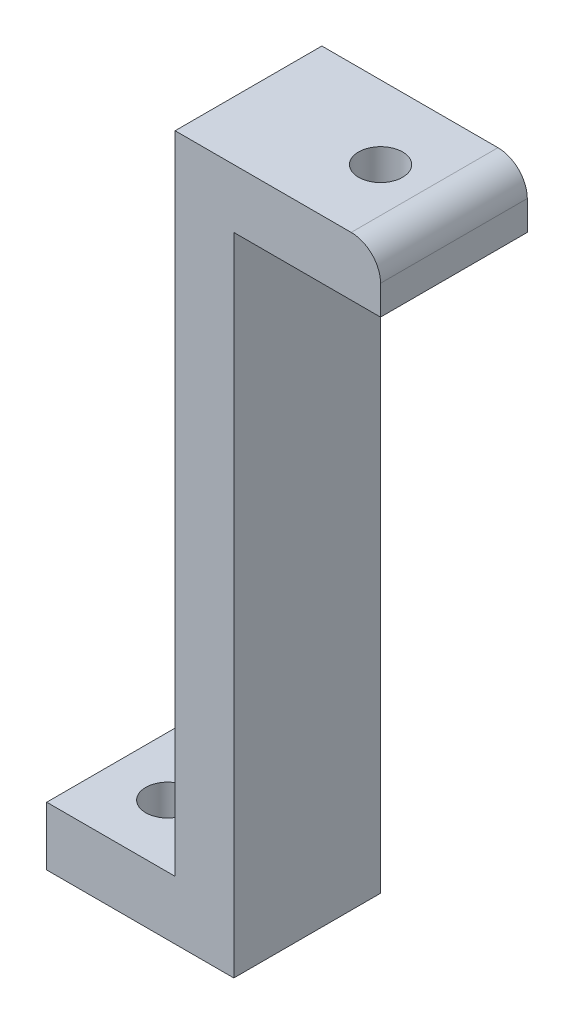
ISO-10303-21;
HEADER;
FILE_DESCRIPTION(('STEP AP214'),'2;1');
FILE_NAME('part.step','',(''),(''),'','','');
FILE_SCHEMA(('AUTOMOTIVE_DESIGN { 1 0 10303 214 1 1 1 1 }'));
ENDSEC;
DATA;
#1=APPLICATION_CONTEXT('core data for automotive mechanical design processes');
#2=APPLICATION_PROTOCOL_DEFINITION('international standard','automotive_design',2000,#1);
#3=PRODUCT_CONTEXT('',#1,'mechanical');
#4=PRODUCT('Part','Part','',(#3));
#5=PRODUCT_RELATED_PRODUCT_CATEGORY('part','',(#4));
#6=PRODUCT_DEFINITION_FORMATION('','',#4);
#7=PRODUCT_DEFINITION_CONTEXT('part definition',#1,'design');
#8=PRODUCT_DEFINITION('design','',#6,#7);
#9=PRODUCT_DEFINITION_SHAPE('','',#8);
#10=(LENGTH_UNIT() NAMED_UNIT(*) SI_UNIT(.MILLI.,.METRE.));
#11=(NAMED_UNIT(*) PLANE_ANGLE_UNIT() SI_UNIT($,.RADIAN.));
#12=(NAMED_UNIT(*) SI_UNIT($,.STERADIAN.) SOLID_ANGLE_UNIT());
#13=UNCERTAINTY_MEASURE_WITH_UNIT(LENGTH_MEASURE(1.E-05),#10,'distance_accuracy_value','');
#14=(GEOMETRIC_REPRESENTATION_CONTEXT(3) GLOBAL_UNCERTAINTY_ASSIGNED_CONTEXT((#13)) GLOBAL_UNIT_ASSIGNED_CONTEXT((#10,
#11,#12)) REPRESENTATION_CONTEXT('',''));
#15=CARTESIAN_POINT('',(0.,0.,0.));
#16=DIRECTION('',(0.,0.,1.));
#17=DIRECTION('',(1.,0.,0.));
#18=AXIS2_PLACEMENT_3D('',#15,#16,#17);
#19=CARTESIAN_POINT('',(0.,-4.,10.));
#20=DIRECTION('',(-1.,0.,0.));
#21=DIRECTION('',(0.,0.,1.));
#22=AXIS2_PLACEMENT_3D('',#19,#20,#21);
#23=PLANE('',#22);
#24=DIRECTION('',(0.,1.,0.));
#25=VECTOR('',#24,1.);
#26=CARTESIAN_POINT('',(0.,-4.,0.));
#27=LINE('',#26,#25);
#28=CARTESIAN_POINT('',(0.,-4.,0.));
#29=VERTEX_POINT('',#28);
#30=CARTESIAN_POINT('',(0.,-2.,0.));
#31=VERTEX_POINT('',#30);
#32=EDGE_CURVE('E156',#29,#31,#27,.T.);
#33=ORIENTED_EDGE('',*,*,#32,.T.);
#34=DIRECTION('',(0.,0.,-1.));
#35=VECTOR('',#34,1.);
#36=CARTESIAN_POINT('',(0.,-2.,10.));
#37=LINE('',#36,#35);
#38=CARTESIAN_POINT('',(0.,-2.,10.));
#39=VERTEX_POINT('',#38);
#40=EDGE_CURVE('E48',#31,#39,#37,.F.);
#41=ORIENTED_EDGE('',*,*,#40,.T.);
#42=DIRECTION('',(0.,1.,0.));
#43=VECTOR('',#42,1.);
#44=CARTESIAN_POINT('',(0.,-4.,10.));
#45=LINE('',#44,#43);
#46=CARTESIAN_POINT('',(0.,-4.,10.));
#47=VERTEX_POINT('',#46);
#48=EDGE_CURVE('E121',#47,#39,#45,.T.);
#49=ORIENTED_EDGE('',*,*,#48,.F.);
#50=DIRECTION('',(0.,0.,-1.));
#51=VECTOR('',#50,1.);
#52=CARTESIAN_POINT('',(0.,-4.,10.));
#53=LINE('',#52,#51);
#54=EDGE_CURVE('E155',#47,#29,#53,.T.);
#55=ORIENTED_EDGE('',*,*,#54,.T.);
#56=EDGE_LOOP('',(#33,#41,#49,#55));
#57=FACE_BOUND('',#56,.T.);
#58=ADVANCED_FACE('F39',(#57),#23,.F.);
#59=CARTESIAN_POINT('',(0.,0.,10.));
#60=DIRECTION('',(0.,-1.,0.));
#61=DIRECTION('',(1.,0.,0.));
#62=AXIS2_PLACEMENT_3D('',#59,#60,#61);
#63=PLANE('',#62);
#64=CARTESIAN_POINT('',(-5.,0.,5.));
#65=DIRECTION('',(0.,-1.,0.));
#66=DIRECTION('',(1.,0.,0.));
#67=AXIS2_PLACEMENT_3D('',#64,#65,#66);
#68=CIRCLE('',#67,1.5);
#69=CARTESIAN_POINT('',(-3.5,0.,5.));
#70=VERTEX_POINT('',#69);
#71=EDGE_CURVE('E240',#70,#70,#68,.T.);
#72=ORIENTED_EDGE('',*,*,#71,.T.);
#73=EDGE_LOOP('',(#72));
#74=FACE_BOUND('',#73,.T.);
#75=DIRECTION('',(-1.,0.,0.));
#76=VECTOR('',#75,1.);
#77=CARTESIAN_POINT('',(0.,0.,10.));
#78=LINE('',#77,#76);
#79=CARTESIAN_POINT('',(-2.,0.,10.));
#80=VERTEX_POINT('',#79);
#81=CARTESIAN_POINT('',(-14.,0.,10.));
#82=VERTEX_POINT('',#81);
#83=EDGE_CURVE('E110',#80,#82,#78,.T.);
#84=ORIENTED_EDGE('',*,*,#83,.F.);
#85=DIRECTION('',(0.,0.,-1.));
#86=VECTOR('',#85,1.);
#87=CARTESIAN_POINT('',(-2.,0.,10.));
#88=LINE('',#87,#86);
#89=CARTESIAN_POINT('',(-2.,0.,0.));
#90=VERTEX_POINT('',#89);
#91=EDGE_CURVE('E130',#80,#90,#88,.T.);
#92=ORIENTED_EDGE('',*,*,#91,.T.);
#93=DIRECTION('',(-1.,0.,0.));
#94=VECTOR('',#93,1.);
#95=CARTESIAN_POINT('',(0.,0.,0.));
#96=LINE('',#95,#94);
#97=CARTESIAN_POINT('',(-14.,0.,0.));
#98=VERTEX_POINT('',#97);
#99=EDGE_CURVE('E126',#90,#98,#96,.T.);
#100=ORIENTED_EDGE('',*,*,#99,.T.);
#101=DIRECTION('',(0.,0.,-1.));
#102=VECTOR('',#101,1.);
#103=CARTESIAN_POINT('',(-14.,0.,10.));
#104=LINE('',#103,#102);
#105=EDGE_CURVE('E124',#82,#98,#104,.T.);
#106=ORIENTED_EDGE('',*,*,#105,.F.);
#107=EDGE_LOOP('',(#84,#92,#100,#106));
#108=FACE_BOUND('',#107,.T.);
#109=ADVANCED_FACE('F125',(#74,#108),#63,.F.);
#110=CARTESIAN_POINT('',(-14.,0.,10.));
#111=DIRECTION('',(1.,0.,0.));
#112=DIRECTION('',(0.,1.,0.));
#113=AXIS2_PLACEMENT_3D('',#110,#111,#112);
#114=PLANE('',#113);
#115=DIRECTION('',(0.,-1.,0.));
#116=VECTOR('',#115,1.);
#117=CARTESIAN_POINT('',(-14.,0.,0.));
#118=LINE('',#117,#116);
#119=CARTESIAN_POINT('',(-14.,-44.,0.));
#120=VERTEX_POINT('',#119);
#121=EDGE_CURVE('E162',#98,#120,#118,.T.);
#122=ORIENTED_EDGE('',*,*,#121,.T.);
#123=DIRECTION('',(0.,0.,-1.));
#124=VECTOR('',#123,1.);
#125=CARTESIAN_POINT('',(-14.,-44.,10.));
#126=LINE('',#125,#124);
#127=CARTESIAN_POINT('',(-14.,-44.,10.));
#128=VERTEX_POINT('',#127);
#129=EDGE_CURVE('E131',#128,#120,#126,.T.);
#130=ORIENTED_EDGE('',*,*,#129,.F.);
#131=DIRECTION('',(0.,-1.,0.));
#132=VECTOR('',#131,1.);
#133=CARTESIAN_POINT('',(-14.,0.,10.));
#134=LINE('',#133,#132);
#135=EDGE_CURVE('E114',#82,#128,#134,.T.);
#136=ORIENTED_EDGE('',*,*,#135,.F.);
#137=ORIENTED_EDGE('',*,*,#105,.T.);
#138=EDGE_LOOP('',(#122,#130,#136,#137));
#139=FACE_BOUND('',#138,.T.);
#140=ADVANCED_FACE('F133',(#139),#114,.F.);
#141=CARTESIAN_POINT('',(-14.,-44.,10.));
#142=DIRECTION('',(0.,-1.,0.));
#143=DIRECTION('',(0.,0.,-1.));
#144=AXIS2_PLACEMENT_3D('',#141,#142,#143);
#145=PLANE('',#144);
#146=CARTESIAN_POINT('',(-18.75,-44.,5.75));
#147=DIRECTION('',(0.,1.,0.));
#148=DIRECTION('',(0.,0.,1.));
#149=AXIS2_PLACEMENT_3D('',#146,#147,#148);
#150=CIRCLE('',#149,1.5);
#151=CARTESIAN_POINT('',(-18.75,-44.,7.25));
#152=VERTEX_POINT('',#151);
#153=EDGE_CURVE('E204',#152,#152,#150,.T.);
#154=ORIENTED_EDGE('',*,*,#153,.F.);
#155=EDGE_LOOP('',(#154));
#156=FACE_BOUND('',#155,.T.);
#157=DIRECTION('',(-1.,0.,0.));
#158=VECTOR('',#157,1.);
#159=CARTESIAN_POINT('',(-14.,-44.,0.));
#160=LINE('',#159,#158);
#161=CARTESIAN_POINT('',(-22.75,-44.,0.));
#162=VERTEX_POINT('',#161);
#163=EDGE_CURVE('E165',#120,#162,#160,.T.);
#164=ORIENTED_EDGE('',*,*,#163,.T.);
#165=DIRECTION('',(0.,0.,-1.));
#166=VECTOR('',#165,1.);
#167=CARTESIAN_POINT('',(-22.75,-44.,10.));
#168=LINE('',#167,#166);
#169=CARTESIAN_POINT('',(-22.75,-44.,10.));
#170=VERTEX_POINT('',#169);
#171=EDGE_CURVE('E195',#170,#162,#168,.T.);
#172=ORIENTED_EDGE('',*,*,#171,.F.);
#173=DIRECTION('',(-1.,0.,0.));
#174=VECTOR('',#173,1.);
#175=CARTESIAN_POINT('',(-14.,-44.,10.));
#176=LINE('',#175,#174);
#177=EDGE_CURVE('E137',#128,#170,#176,.T.);
#178=ORIENTED_EDGE('',*,*,#177,.F.);
#179=ORIENTED_EDGE('',*,*,#129,.T.);
#180=EDGE_LOOP('',(#164,#172,#178,#179));
#181=FACE_BOUND('',#180,.T.);
#182=ADVANCED_FACE('F214',(#156,#181),#145,.F.);
#183=CARTESIAN_POINT('',(-22.75,-44.,10.));
#184=DIRECTION('',(1.,0.,0.));
#185=DIRECTION('',(0.,0.,-1.));
#186=AXIS2_PLACEMENT_3D('',#183,#184,#185);
#187=PLANE('',#186);
#188=DIRECTION('',(0.,-1.,0.));
#189=VECTOR('',#188,1.);
#190=CARTESIAN_POINT('',(-22.75,-44.,0.));
#191=LINE('',#190,#189);
#192=CARTESIAN_POINT('',(-22.75,-48.,0.));
#193=VERTEX_POINT('',#192);
#194=EDGE_CURVE('E168',#162,#193,#191,.T.);
#195=ORIENTED_EDGE('',*,*,#194,.T.);
#196=DIRECTION('',(0.,0.,-1.));
#197=VECTOR('',#196,1.);
#198=CARTESIAN_POINT('',(-22.75,-48.,10.));
#199=LINE('',#198,#197);
#200=CARTESIAN_POINT('',(-22.75,-48.,10.));
#201=VERTEX_POINT('',#200);
#202=EDGE_CURVE('E191',#201,#193,#199,.T.);
#203=ORIENTED_EDGE('',*,*,#202,.F.);
#204=DIRECTION('',(0.,-1.,0.));
#205=VECTOR('',#204,1.);
#206=CARTESIAN_POINT('',(-22.75,-44.,10.));
#207=LINE('',#206,#205);
#208=EDGE_CURVE('E140',#170,#201,#207,.T.);
#209=ORIENTED_EDGE('',*,*,#208,.F.);
#210=ORIENTED_EDGE('',*,*,#171,.T.);
#211=EDGE_LOOP('',(#195,#203,#209,#210));
#212=FACE_BOUND('',#211,.T.);
#213=ADVANCED_FACE('F221',(#212),#187,.F.);
#214=CARTESIAN_POINT('',(-22.75,-48.,10.));
#215=DIRECTION('',(0.,1.,0.));
#216=DIRECTION('',(0.,0.,1.));
#217=AXIS2_PLACEMENT_3D('',#214,#215,#216);
#218=PLANE('',#217);
#219=CARTESIAN_POINT('',(-18.75,-48.,5.75));
#220=DIRECTION('',(0.,1.,0.));
#221=DIRECTION('',(0.,0.,1.));
#222=AXIS2_PLACEMENT_3D('',#219,#220,#221);
#223=CIRCLE('',#222,1.5);
#224=CARTESIAN_POINT('',(-18.75,-48.,7.25));
#225=VERTEX_POINT('',#224);
#226=EDGE_CURVE('E159',#225,#225,#223,.T.);
#227=ORIENTED_EDGE('',*,*,#226,.T.);
#228=EDGE_LOOP('',(#227));
#229=FACE_BOUND('',#228,.T.);
#230=DIRECTION('',(1.,0.,0.));
#231=VECTOR('',#230,1.);
#232=CARTESIAN_POINT('',(-22.75,-48.,0.));
#233=LINE('',#232,#231);
#234=CARTESIAN_POINT('',(-10.,-48.,0.));
#235=VERTEX_POINT('',#234);
#236=EDGE_CURVE('E171',#193,#235,#233,.T.);
#237=ORIENTED_EDGE('',*,*,#236,.T.);
#238=DIRECTION('',(0.,0.,-1.));
#239=VECTOR('',#238,1.);
#240=CARTESIAN_POINT('',(-10.,-48.,10.));
#241=LINE('',#240,#239);
#242=CARTESIAN_POINT('',(-10.,-48.,10.));
#243=VERTEX_POINT('',#242);
#244=EDGE_CURVE('E187',#243,#235,#241,.T.);
#245=ORIENTED_EDGE('',*,*,#244,.F.);
#246=DIRECTION('',(1.,0.,0.));
#247=VECTOR('',#246,1.);
#248=CARTESIAN_POINT('',(-22.75,-48.,10.));
#249=LINE('',#248,#247);
#250=EDGE_CURVE('E146',#201,#243,#249,.T.);
#251=ORIENTED_EDGE('',*,*,#250,.F.);
#252=ORIENTED_EDGE('',*,*,#202,.T.);
#253=EDGE_LOOP('',(#237,#245,#251,#252));
#254=FACE_BOUND('',#253,.T.);
#255=ADVANCED_FACE('F224',(#229,#254),#218,.F.);
#256=CARTESIAN_POINT('',(-10.,-48.,10.));
#257=DIRECTION('',(-1.,0.,0.));
#258=DIRECTION('',(0.,0.,1.));
#259=AXIS2_PLACEMENT_3D('',#256,#257,#258);
#260=PLANE('',#259);
#261=DIRECTION('',(0.,1.,0.));
#262=VECTOR('',#261,1.);
#263=CARTESIAN_POINT('',(-10.,-48.,0.));
#264=LINE('',#263,#262);
#265=CARTESIAN_POINT('',(-10.,-4.,0.));
#266=VERTEX_POINT('',#265);
#267=EDGE_CURVE('E174',#235,#266,#264,.T.);
#268=ORIENTED_EDGE('',*,*,#267,.T.);
#269=DIRECTION('',(0.,0.,-1.));
#270=VECTOR('',#269,1.);
#271=CARTESIAN_POINT('',(-10.,-4.,10.));
#272=LINE('',#271,#270);
#273=CARTESIAN_POINT('',(-10.,-4.,10.));
#274=VERTEX_POINT('',#273);
#275=EDGE_CURVE('E183',#274,#266,#272,.T.);
#276=ORIENTED_EDGE('',*,*,#275,.F.);
#277=DIRECTION('',(0.,1.,0.));
#278=VECTOR('',#277,1.);
#279=CARTESIAN_POINT('',(-10.,-48.,10.));
#280=LINE('',#279,#278);
#281=EDGE_CURVE('E149',#243,#274,#280,.T.);
#282=ORIENTED_EDGE('',*,*,#281,.F.);
#283=ORIENTED_EDGE('',*,*,#244,.T.);
#284=EDGE_LOOP('',(#268,#276,#282,#283));
#285=FACE_BOUND('',#284,.T.);
#286=ADVANCED_FACE('F229',(#285),#260,.F.);
#287=CARTESIAN_POINT('',(-10.,-4.,10.));
#288=DIRECTION('',(0.,1.,0.));
#289=DIRECTION('',(0.,0.,1.));
#290=AXIS2_PLACEMENT_3D('',#287,#288,#289);
#291=PLANE('',#290);
#292=CARTESIAN_POINT('',(-5.,-4.,5.));
#293=DIRECTION('',(0.,-1.,0.));
#294=DIRECTION('',(0.,0.,-1.));
#295=AXIS2_PLACEMENT_3D('',#292,#293,#294);
#296=CIRCLE('',#295,1.5);
#297=CARTESIAN_POINT('',(-5.,-4.,3.5));
#298=VERTEX_POINT('',#297);
#299=EDGE_CURVE('E244',#298,#298,#296,.T.);
#300=ORIENTED_EDGE('',*,*,#299,.F.);
#301=EDGE_LOOP('',(#300));
#302=FACE_BOUND('',#301,.T.);
#303=DIRECTION('',(1.,0.,0.));
#304=VECTOR('',#303,1.);
#305=CARTESIAN_POINT('',(-10.,-4.,0.));
#306=LINE('',#305,#304);
#307=EDGE_CURVE('E177',#266,#29,#306,.T.);
#308=ORIENTED_EDGE('',*,*,#307,.T.);
#309=ORIENTED_EDGE('',*,*,#54,.F.);
#310=DIRECTION('',(1.,0.,0.));
#311=VECTOR('',#310,1.);
#312=CARTESIAN_POINT('',(-10.,-4.,10.));
#313=LINE('',#312,#311);
#314=EDGE_CURVE('E152',#274,#47,#313,.T.);
#315=ORIENTED_EDGE('',*,*,#314,.F.);
#316=ORIENTED_EDGE('',*,*,#275,.T.);
#317=EDGE_LOOP('',(#308,#309,#315,#316));
#318=FACE_BOUND('',#317,.T.);
#319=ADVANCED_FACE('F233',(#302,#318),#291,.F.);
#320=CARTESIAN_POINT('',(0.,0.,10.));
#321=DIRECTION('',(0.,0.,1.));
#322=DIRECTION('',(1.,0.,0.));
#323=AXIS2_PLACEMENT_3D('',#320,#321,#322);
#324=PLANE('',#323);
#325=ORIENTED_EDGE('',*,*,#48,.T.);
#326=CARTESIAN_POINT('',(-2.,-2.,10.));
#327=DIRECTION('',(0.,0.,1.));
#328=DIRECTION('',(1.,0.,0.));
#329=AXIS2_PLACEMENT_3D('',#326,#327,#328);
#330=CIRCLE('',#329,2.);
#331=EDGE_CURVE('E11',#39,#80,#330,.T.);
#332=ORIENTED_EDGE('',*,*,#331,.T.);
#333=ORIENTED_EDGE('',*,*,#83,.T.);
#334=ORIENTED_EDGE('',*,*,#135,.T.);
#335=ORIENTED_EDGE('',*,*,#177,.T.);
#336=ORIENTED_EDGE('',*,*,#208,.T.);
#337=ORIENTED_EDGE('',*,*,#250,.T.);
#338=ORIENTED_EDGE('',*,*,#281,.T.);
#339=ORIENTED_EDGE('',*,*,#314,.T.);
#340=EDGE_LOOP('',(#325,#332,#333,#334,#335,#336,#337,#338,#339));
#341=FACE_BOUND('',#340,.T.);
#342=ADVANCED_FACE('F112',(#341),#324,.T.);
#343=CARTESIAN_POINT('',(0.,0.,0.));
#344=DIRECTION('',(0.,0.,1.));
#345=DIRECTION('',(1.,0.,0.));
#346=AXIS2_PLACEMENT_3D('',#343,#344,#345);
#347=PLANE('',#346);
#348=ORIENTED_EDGE('',*,*,#99,.F.);
#349=CARTESIAN_POINT('',(-2.,-2.,0.));
#350=DIRECTION('',(0.,0.,1.));
#351=DIRECTION('',(1.,0.,0.));
#352=AXIS2_PLACEMENT_3D('',#349,#350,#351);
#353=CIRCLE('',#352,2.);
#354=EDGE_CURVE('E62',#90,#31,#353,.F.);
#355=ORIENTED_EDGE('',*,*,#354,.T.);
#356=ORIENTED_EDGE('',*,*,#32,.F.);
#357=ORIENTED_EDGE('',*,*,#307,.F.);
#358=ORIENTED_EDGE('',*,*,#267,.F.);
#359=ORIENTED_EDGE('',*,*,#236,.F.);
#360=ORIENTED_EDGE('',*,*,#194,.F.);
#361=ORIENTED_EDGE('',*,*,#163,.F.);
#362=ORIENTED_EDGE('',*,*,#121,.F.);
#363=EDGE_LOOP('',(#348,#355,#356,#357,#358,#359,#360,#361,#362));
#364=FACE_BOUND('',#363,.T.);
#365=ADVANCED_FACE('F210',(#364),#347,.F.);
#366=CARTESIAN_POINT('',(-18.75,-54.,5.75));
#367=DIRECTION('',(0.,1.,0.));
#368=DIRECTION('',(0.,0.,1.));
#369=AXIS2_PLACEMENT_3D('',#366,#367,#368);
#370=CYLINDRICAL_SURFACE('',#369,1.5);
#371=ORIENTED_EDGE('',*,*,#153,.T.);
#372=EDGE_LOOP('',(#371));
#373=FACE_BOUND('',#372,.T.);
#374=ORIENTED_EDGE('',*,*,#226,.F.);
#375=EDGE_LOOP('',(#374));
#376=FACE_BOUND('',#375,.T.);
#377=ADVANCED_FACE('F281',(#373,#376),#370,.F.);
#378=CARTESIAN_POINT('',(-5.,6.,5.));
#379=DIRECTION('',(0.,-1.,0.));
#380=DIRECTION('',(0.,0.,-1.));
#381=AXIS2_PLACEMENT_3D('',#378,#379,#380);
#382=CYLINDRICAL_SURFACE('',#381,1.5);
#383=ORIENTED_EDGE('',*,*,#299,.T.);
#384=EDGE_LOOP('',(#383));
#385=FACE_BOUND('',#384,.T.);
#386=ORIENTED_EDGE('',*,*,#71,.F.);
#387=EDGE_LOOP('',(#386));
#388=FACE_BOUND('',#387,.T.);
#389=ADVANCED_FACE('F249',(#385,#388),#382,.F.);
#390=CARTESIAN_POINT('',(-2.,-2.,10.));
#391=DIRECTION('',(0.,0.,-1.));
#392=DIRECTION('',(-1.,0.,0.));
#393=AXIS2_PLACEMENT_3D('',#390,#391,#392);
#394=CYLINDRICAL_SURFACE('',#393,2.);
#395=ORIENTED_EDGE('',*,*,#331,.F.);
#396=ORIENTED_EDGE('',*,*,#40,.F.);
#397=ORIENTED_EDGE('',*,*,#354,.F.);
#398=ORIENTED_EDGE('',*,*,#91,.F.);
#399=EDGE_LOOP('',(#395,#396,#397,#398));
#400=FACE_BOUND('',#399,.T.);
#401=ADVANCED_FACE('F41',(#400),#394,.T.);
#402=CLOSED_SHELL('',(#58,#109,#140,#182,#213,#255,#286,#319,#342,#365,#377,#389,#401));
#403=MANIFOLD_SOLID_BREP('B2',#402);
#404=ADVANCED_BREP_SHAPE_REPRESENTATION('',(#18,#403),#14);
#405=SHAPE_DEFINITION_REPRESENTATION(#9,#404);
ENDSEC;
END-ISO-10303-21;
